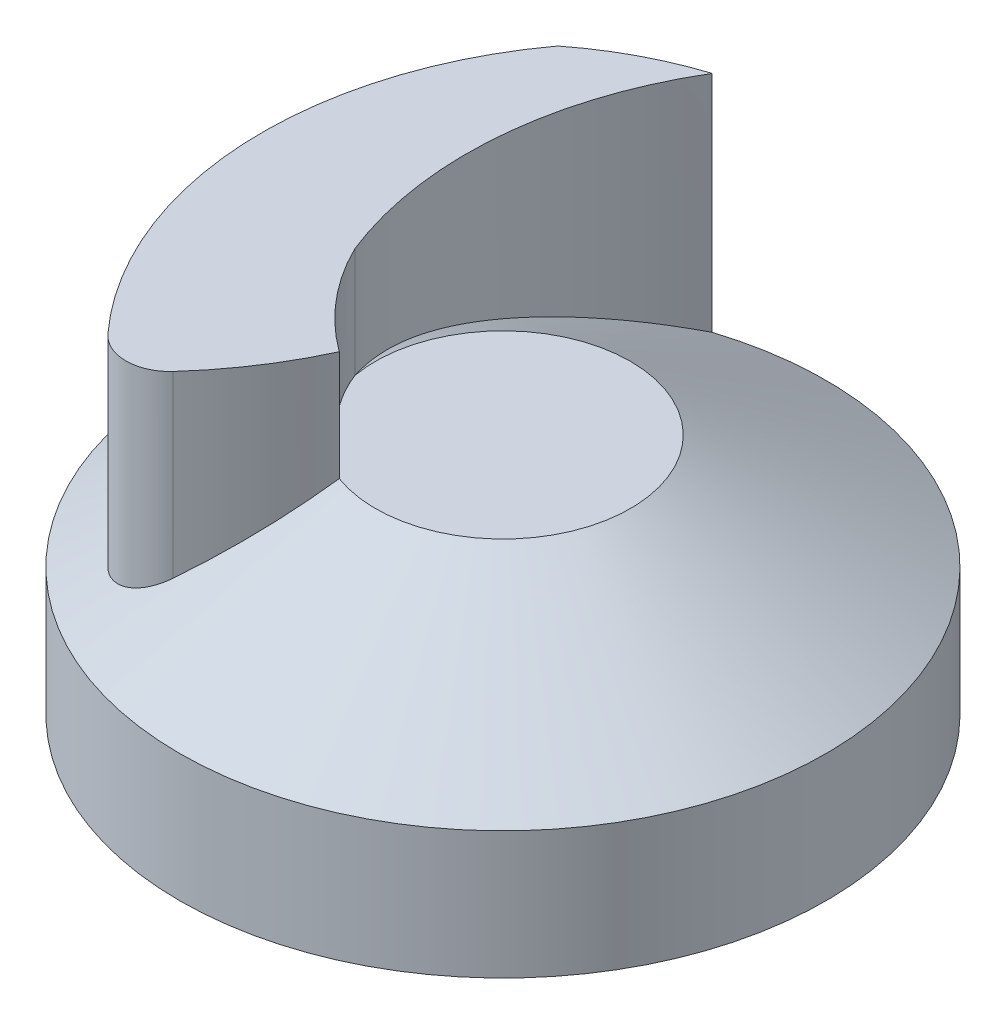
ISO-10303-21;
HEADER;
FILE_DESCRIPTION(('STEP AP214'),'2;1');
FILE_NAME('part.step','',(''),(''),'','','');
FILE_SCHEMA(('AUTOMOTIVE_DESIGN { 1 0 10303 214 1 1 1 1 }'));
ENDSEC;
DATA;
#1=APPLICATION_CONTEXT('core data for automotive mechanical design processes');
#2=APPLICATION_PROTOCOL_DEFINITION('international standard','automotive_design',2000,#1);
#3=PRODUCT_CONTEXT('',#1,'mechanical');
#4=PRODUCT('Part','Part','',(#3));
#5=PRODUCT_RELATED_PRODUCT_CATEGORY('part','',(#4));
#6=PRODUCT_DEFINITION_FORMATION('','',#4);
#7=PRODUCT_DEFINITION_CONTEXT('part definition',#1,'design');
#8=PRODUCT_DEFINITION('design','',#6,#7);
#9=PRODUCT_DEFINITION_SHAPE('','',#8);
#10=(LENGTH_UNIT() NAMED_UNIT(*) SI_UNIT(.MILLI.,.METRE.));
#11=(NAMED_UNIT(*) PLANE_ANGLE_UNIT() SI_UNIT($,.RADIAN.));
#12=(NAMED_UNIT(*) SI_UNIT($,.STERADIAN.) SOLID_ANGLE_UNIT());
#13=UNCERTAINTY_MEASURE_WITH_UNIT(LENGTH_MEASURE(1.E-05),#10,'distance_accuracy_value','');
#14=(GEOMETRIC_REPRESENTATION_CONTEXT(3) GLOBAL_UNCERTAINTY_ASSIGNED_CONTEXT((#13)) GLOBAL_UNIT_ASSIGNED_CONTEXT((#10,
#11,#12)) REPRESENTATION_CONTEXT('',''));
#15=CARTESIAN_POINT('',(0.,0.,0.));
#16=DIRECTION('',(0.,0.,1.));
#17=DIRECTION('',(1.,0.,0.));
#18=AXIS2_PLACEMENT_3D('',#15,#16,#17);
#19=CARTESIAN_POINT('',(0.,55.,0.));
#20=DIRECTION('',(0.,-1.,0.));
#21=DIRECTION('',(0.,0.,-1.));
#22=AXIS2_PLACEMENT_3D('',#19,#20,#21);
#23=CONICAL_SURFACE('',#22,29.,1.0420235544597);
#24=CARTESIAN_POINT('',(0.,29.,0.));
#25=DIRECTION('',(0.,1.,0.));
#26=DIRECTION('',(0.,0.,1.));
#27=AXIS2_PLACEMENT_3D('',#24,#25,#26);
#28=CIRCLE('',#27,73.5);
#29=CARTESIAN_POINT('',(-45.3802712873351,29.,-57.8176528223679));
#30=VERTEX_POINT('',#29);
#31=CARTESIAN_POINT('',(-22.4109348310149,29.,-70.));
#32=VERTEX_POINT('',#31);
#33=EDGE_CURVE('E42',#30,#32,#28,.T.);
#34=ORIENTED_EDGE('',*,*,#33,.T.);
#35=CARTESIAN_POINT('',(-28.5496093591363,55.0000251123417,5.09090488613945));
#36=CARTESIAN_POINT('',(-28.7247293869199,54.9445886567146,4.64936329136834));
#37=CARTESIAN_POINT('',(-28.8959571431098,54.8849374572389,4.20683193821065));
#38=CARTESIAN_POINT('',(-29.2306068688858,54.7575686923744,3.32000095261469));
#39=CARTESIAN_POINT('',(-29.3940291400212,54.6898514389553,2.87570138920728));
#40=CARTESIAN_POINT('',(-29.8724651668681,54.4751879033156,1.54072436381063));
#41=CARTESIAN_POINT('',(-30.1757695225688,54.3166909231365,0.647662283714218));
#42=CARTESIAN_POINT('',(-30.7505635430646,53.9723720468749,-1.14151408025421));
#43=CARTESIAN_POINT('',(-31.022109283024,53.7865996598121,-2.03762001914171));
#44=CARTESIAN_POINT('',(-31.5342123318471,53.3906673983505,-3.8333534641001));
#45=CARTESIAN_POINT('',(-31.7747671321185,53.1805055523369,-4.73298124918472));
#46=CARTESIAN_POINT('',(-32.2241151556233,52.739825623971,-6.5306637466509));
#47=CARTESIAN_POINT('',(-32.4330446938781,52.5094020932246,-7.42870770081441));
#48=CARTESIAN_POINT('',(-32.820714659758,52.030184860642,-9.22635561490741));
#49=CARTESIAN_POINT('',(-32.9994560289516,51.7813917321012,-10.1259595252974));
#50=CARTESIAN_POINT('',(-33.3271810464768,51.2677673164424,-11.926621456102));
#51=CARTESIAN_POINT('',(-33.4761460304203,51.0029261047628,-12.8276800338834));
#52=CARTESIAN_POINT('',(-33.7444993726721,50.4595583373506,-14.6300865371042));
#53=CARTESIAN_POINT('',(-33.8638865543755,50.1810312377214,-15.5314344726265));
#54=CARTESIAN_POINT('',(-34.112134747156,49.5070347498777,-17.6672597962915));
#55=CARTESIAN_POINT('',(-34.2281625516512,49.1064207652498,-18.9016241749851));
#56=CARTESIAN_POINT('',(-34.4059766386284,48.2874492487803,-21.3684022718282));
#57=CARTESIAN_POINT('',(-34.4677593796237,47.8690905603128,-22.6008158573742));
#58=CARTESIAN_POINT('',(-34.5377134517432,47.0181034304952,-25.0623315930712));
#59=CARTESIAN_POINT('',(-34.5458805413163,46.5854738628924,-26.2914334735437));
#60=CARTESIAN_POINT('',(-34.5091660389487,45.7088709823813,-28.7447457629525));
#61=CARTESIAN_POINT('',(-34.4642854938114,45.2648978934871,-29.9689562679332));
#62=CARTESIAN_POINT('',(-34.321750676871,44.3663533566904,-32.4154419007068));
#63=CARTESIAN_POINT('',(-34.2239056756637,43.911749321794,-33.6376939228971));
#64=CARTESIAN_POINT('',(-33.9758315836886,42.9955038144428,-36.0742181547678));
#65=CARTESIAN_POINT('',(-33.8256020109763,42.5338622772796,-37.2884902909275));
#66=CARTESIAN_POINT('',(-33.4732784284575,41.6052689926367,-39.7072956347435));
#67=CARTESIAN_POINT('',(-33.271190289594,41.1383178519759,-40.9118299289154));
#68=CARTESIAN_POINT('',(-32.8156834848174,40.2005059983908,-43.3095156354489));
#69=CARTESIAN_POINT('',(-32.5622657469904,39.7296453563016,-44.5026672532113));
#70=CARTESIAN_POINT('',(-31.7795579163247,38.4041001980136,-47.8336555198943));
#71=CARTESIAN_POINT('',(-31.1926515501607,37.5462457656495,-49.9570008665083));
#72=CARTESIAN_POINT('',(-29.8564335804122,35.8277238163859,-54.1502866897657));
#73=CARTESIAN_POINT('',(-29.1071331114241,34.9670564963358,-56.2202308169949));
#74=CARTESIAN_POINT('',(-27.4543596719912,33.2519088563651,-60.2855556958705));
#75=CARTESIAN_POINT('',(-26.551743048287,32.397420261479,-62.2812793622678));
#76=CARTESIAN_POINT('',(-25.0837272321493,31.1198226341435,-65.2192330188066));
#77=CARTESIAN_POINT('',(-24.5753056186949,30.6945951886593,-66.1893920133372));
#78=CARTESIAN_POINT('',(-23.5210092894647,29.8458722644486,-68.1099261270441));
#79=CARTESIAN_POINT('',(-22.9751342759545,29.4223767995188,-69.0603010888697));
#80=CARTESIAN_POINT('',(-22.4108147497686,28.9999101028993,-70.0002));
#81=B_SPLINE_CURVE_WITH_KNOTS('',3,(#35,#36,#37,#38,#39,#40,#41,#42,#43,#44,#45,#46,#47,#48,#49,
#50,#51,#52,#53,#54,#55,#56,#57,#58,#59,#60,#61,#62,#63,#64,#65,#66,#67,#68,#69,#70,#71,#72,#73,
#74,#75,#76,#77,#78,#79,#80),.UNSPECIFIED.,.F.,.F.,(4,2,2,2,2,2,2,2,2,2,2,2,2,2,2,2,2,2,2,2,2,2,
4),(0.,1.43459789234834,2.86914031695721,5.7372309080942,8.60017840597506,11.4633575025661,
14.3138206220499,17.1641948192244,20.0163501192061,22.8686188597161,26.776025160962,
30.6836865452975,34.591657062229,38.4995504633927,42.4216110513209,46.3437077236409,
50.2653605685007,54.186942512629,61.2724947180983,68.3575612543428,75.4042826096296,
78.9284892230699,82.4527238553029),.UNSPECIFIED.);
#82=CARTESIAN_POINT('',(-28.5496886806535,55.,5.09070488613945));
#83=VERTEX_POINT('',#82);
#84=EDGE_CURVE('E92',#83,#32,#81,.T.);
#85=ORIENTED_EDGE('',*,*,#84,.F.);
#86=CARTESIAN_POINT('',(0.,55.,0.));
#87=DIRECTION('',(0.,1.,0.));
#88=DIRECTION('',(0.,0.,1.));
#89=AXIS2_PLACEMENT_3D('',#86,#87,#88);
#90=CIRCLE('',#89,29.);
#91=CARTESIAN_POINT('',(-10.,55.,27.2213151776324));
#92=VERTEX_POINT('',#91);
#93=EDGE_CURVE('E200',#92,#83,#90,.T.);
#94=ORIENTED_EDGE('',*,*,#93,.F.);
#95=CARTESIAN_POINT('',(-25.0001805905201,39.2820014331821,50.0002));
#96=CARTESIAN_POINT('',(-24.2302435684098,39.9287819968627,49.1475154465924));
#97=CARTESIAN_POINT('',(-23.4772520738642,40.5770039817991,48.2807691942579));
#98=CARTESIAN_POINT('',(-22.0059363113249,41.8762056707809,46.5203565612396));
#99=CARTESIAN_POINT('',(-21.2876116941636,42.5271853469787,45.6266904518421));
#100=CARTESIAN_POINT('',(-19.1920482387325,44.4782564394082,42.9152020699937));
#101=CARTESIAN_POINT('',(-17.8673186281698,45.7822690667879,41.0592381409055));
#102=CARTESIAN_POINT('',(-15.3648999147257,48.3987321464562,37.2564401960887));
#103=CARTESIAN_POINT('',(-14.1872088014585,49.7111824831222,35.3096074232658));
#104=CARTESIAN_POINT('',(-12.5326639744902,51.6875370241471,32.3252642255017));
#105=CARTESIAN_POINT('',(-11.9987482249833,52.3490876723367,31.3174781194841));
#106=CARTESIAN_POINT('',(-10.9699355013665,53.6735963781706,29.2830952167538));
#107=CARTESIAN_POINT('',(-10.4750383939112,54.3365544309971,28.2564984843408));
#108=CARTESIAN_POINT('',(-9.99990822117822,55.0001281777053,27.2211151776324));
#109=B_SPLINE_CURVE_WITH_KNOTS('',3,(#95,#96,#97,#98,#99,#100,#101,#102,#103,#104,#105,#106,
#107,#108),.UNSPECIFIED.,.F.,.F.,(4,2,2,2,2,2,4),(0.,3.9548527858312,7.90966572974658,
15.7839064883536,23.6580395745044,27.6128088161583,31.5675645418742),.UNSPECIFIED.);
#110=CARTESIAN_POINT('',(-25.,39.2821531376435,50.));
#111=VERTEX_POINT('',#110);
#112=EDGE_CURVE('E49',#111,#92,#109,.T.);
#113=ORIENTED_EDGE('',*,*,#112,.F.);
#114=CARTESIAN_POINT('',(-39.8270914709987,34.5867522655805,50.018777727555));
#115=CARTESIAN_POINT('',(-39.6567234212681,34.5629342375431,50.2065580385633));
#116=CARTESIAN_POINT('',(-39.4788566286282,34.5438071174008,50.3881363762668));
#117=CARTESIAN_POINT('',(-39.1094261465787,34.5150414548326,50.737577514022));
#118=CARTESIAN_POINT('',(-38.9178630144057,34.5054025266144,50.9054408714739));
#119=CARTESIAN_POINT('',(-38.522725270415,34.4957278222526,51.2258325040002));
#120=CARTESIAN_POINT('',(-38.3191756647436,34.4956727160212,51.3783910266266));
#121=CARTESIAN_POINT('',(-37.9012028926494,34.50511279651,51.6674575146318));
#122=CARTESIAN_POINT('',(-37.6867800408312,34.5146077070612,51.8039659440223));
#123=CARTESIAN_POINT('',(-37.2485363074208,34.5430687118088,52.0600819310439));
#124=CARTESIAN_POINT('',(-37.0247110254465,34.562039286927,52.1796814583053));
#125=CARTESIAN_POINT('',(-36.5694205209893,34.6092835271021,52.4011971956577));
#126=CARTESIAN_POINT('',(-36.3379550814803,34.6375574566349,52.5031129029071));
#127=CARTESIAN_POINT('',(-35.8691044700781,34.7031600794735,52.6887580097667));
#128=CARTESIAN_POINT('',(-35.6317194394586,34.7404885568737,52.7724878429289));
#129=CARTESIAN_POINT('',(-35.1527352151216,34.8238855760797,52.9214789628403));
#130=CARTESIAN_POINT('',(-34.911135997719,34.8699541670223,52.9867401457539));
#131=CARTESIAN_POINT('',(-34.4220667123093,34.9711505806392,53.0994769725287));
#132=CARTESIAN_POINT('',(-34.1745615769713,35.0263940496457,53.1466962499646));
#133=CARTESIAN_POINT('',(-33.6786308436411,35.1450479880956,53.2221711951305));
#134=CARTESIAN_POINT('',(-33.4302052402213,35.2084585057709,53.2504267508607));
#135=CARTESIAN_POINT('',(-32.9340042179046,35.3429856418787,53.2882511364478));
#136=CARTESIAN_POINT('',(-32.686228863784,35.4141030002754,53.2978181702652));
#137=CARTESIAN_POINT('',(-32.1927537084432,35.5635746789883,53.2986820299571));
#138=CARTESIAN_POINT('',(-31.9470547207979,35.6419317044328,53.289971999931));
#139=CARTESIAN_POINT('',(-31.4417082175656,35.8112170928674,53.253546614573));
#140=CARTESIAN_POINT('',(-31.182322431993,35.9026439157979,53.2245144166262));
#141=CARTESIAN_POINT('',(-30.669063753363,36.0926162025022,53.1468417233973));
#142=CARTESIAN_POINT('',(-30.4151929566308,36.1911643136624,53.098193904776));
#143=CARTESIAN_POINT('',(-29.9144221479294,36.3947363822203,52.9821637712528));
#144=CARTESIAN_POINT('',(-29.6675224934616,36.49976067086,52.9147804974544));
#145=CARTESIAN_POINT('',(-29.1818531974549,36.7157064766536,52.762195624983));
#146=CARTESIAN_POINT('',(-28.9430864779007,36.8266300773931,52.6769876992093));
#147=CARTESIAN_POINT('',(-28.4502668148856,37.0656758787659,52.4799098789511));
#148=CARTESIAN_POINT('',(-28.1972394123735,37.1943813157933,52.3661803505147));
#149=CARTESIAN_POINT('',(-27.7038049857039,37.4574626797582,52.1195071894869));
#150=CARTESIAN_POINT('',(-27.4633991975926,37.5918391597505,51.9865616798239));
#151=CARTESIAN_POINT('',(-26.9964227799646,37.8654541863057,51.7028615418061));
#152=CARTESIAN_POINT('',(-26.769847121483,38.0046909362596,51.552113446121));
#153=CARTESIAN_POINT('',(-26.3314561951344,38.2873145917907,51.2341349167459));
#154=CARTESIAN_POINT('',(-26.1196365197343,38.4307002398457,51.0669094411067));
#155=CARTESIAN_POINT('',(-25.7526514102356,38.6917096464332,50.7524748800498));
#156=CARTESIAN_POINT('',(-25.5946675550872,38.8087059337068,50.6080173577931));
#157=CARTESIAN_POINT('',(-25.2893122947923,39.0443168429925,50.310361057051));
#158=CARTESIAN_POINT('',(-25.1419185726763,39.1629273954642,50.1571819574197));
#159=CARTESIAN_POINT('',(-24.999819414915,39.2823048406305,49.9998));
#160=B_SPLINE_CURVE_WITH_KNOTS('',3,(#114,#115,#116,#117,#118,#119,#120,#121,#122,#123,#124,
#125,#126,#127,#128,#129,#130,#131,#132,#133,#134,#135,#136,#137,#138,#139,#140,#141,#142,#143,
#144,#145,#146,#147,#148,#149,#150,#151,#152,#153,#154,#155,#156,#157,#158,#159),.UNSPECIFIED.,
.F.,.F.,(4,2,2,2,2,2,2,2,2,2,2,2,2,2,2,2,2,2,2,2,2,2,4),(0.,0.763775088407774,1.52751912023176,
2.28972270079676,3.0519042404749,3.81444654786146,4.57701053467608,5.33955633993642,
6.10210643234286,6.8751212115434,7.64814055613259,8.42123418722674,9.19461786493888,
10.0234069020394,10.8525056479899,11.6816468357316,12.5110828392578,13.4275665681897,
14.3441398824258,15.260377898552,16.1763410553222,16.9078317263136,17.6377327130041),.UNSPECIFIED.);
#161=CARTESIAN_POINT('',(-39.8268914709987,34.5867243304696,50.0189980924498));
#162=VERTEX_POINT('',#161);
#163=EDGE_CURVE('E162',#162,#111,#160,.T.);
#164=ORIENTED_EDGE('',*,*,#163,.F.);
#165=CARTESIAN_POINT('',(-45.3801242042821,28.9999611370027,-57.8178528223679));
#166=CARTESIAN_POINT('',(-46.0936625235382,29.1884900463303,-56.8476282385105));
#167=CARTESIAN_POINT('',(-46.786778690679,29.3753720268394,-55.862061308107));
#168=CARTESIAN_POINT('',(-48.1309548762064,29.7453591388384,-53.8619558729894));
#169=CARTESIAN_POINT('',(-48.7820146257098,29.9284642461761,-52.8474171831072));
#170=CARTESIAN_POINT('',(-50.0408893452799,30.2904215041911,-50.7910409235312));
#171=CARTESIAN_POINT('',(-50.6487020897682,30.4692734356765,-49.7492019526793));
#172=CARTESIAN_POINT('',(-51.8199090963239,30.8222136861132,-47.6400639854042));
#173=CARTESIAN_POINT('',(-52.3833034903914,30.9963020192196,-46.5727650646538));
#174=CARTESIAN_POINT('',(-53.4649656848338,31.3393201139603,-44.413812375013));
#175=CARTESIAN_POINT('',(-53.983202952125,31.508246335873,-43.3221427448229));
#176=CARTESIAN_POINT('',(-54.9731684852204,31.8403122651744,-41.1169247708001));
#177=CARTESIAN_POINT('',(-55.4448923840807,32.0034514283219,-40.0033743844235));
#178=CARTESIAN_POINT('',(-56.3407837836841,32.3233769574339,-37.7565769093136));
#179=CARTESIAN_POINT('',(-56.7649574717557,32.4801641482302,-36.6233324054351));
#180=CARTESIAN_POINT('',(-57.5649978660795,32.7868894282336,-34.3388811966237));
#181=CARTESIAN_POINT('',(-57.9408600261195,32.9368268720112,-33.1876728126673));
#182=CARTESIAN_POINT('',(-58.6426823833452,33.2289829753578,-30.8719576067118));
#183=CARTESIAN_POINT('',(-58.9687496348095,33.3712177572546,-29.7074852669008));
#184=CARTESIAN_POINT('',(-59.5712948996856,33.6478037915859,-27.3647329343391));
#185=CARTESIAN_POINT('',(-59.8477681972535,33.782154293495,-26.1864516398443));
#186=CARTESIAN_POINT('',(-60.3504548929229,34.042424079709,-23.8183877432582));
#187=CARTESIAN_POINT('',(-60.5766721691074,34.1683440140473,-22.6286060360127));
#188=CARTESIAN_POINT('',(-60.978367977323,34.4112641411617,-20.2394815651454));
#189=CARTESIAN_POINT('',(-61.1538415733377,34.528263465384,-19.040137883049));
#190=CARTESIAN_POINT('',(-61.4534345896769,34.7527197010849,-16.6354060362491));
#191=CARTESIAN_POINT('',(-61.5776057663522,34.8601861433906,-15.4300252111546));
#192=CARTESIAN_POINT('',(-61.7745228934633,35.0652495449596,-13.0140834218991));
#193=CARTESIAN_POINT('',(-61.847262612167,35.1628453070071,-11.8035218478804));
#194=CARTESIAN_POINT('',(-61.9410521912171,35.3477059807402,-9.37963409089838));
#195=CARTESIAN_POINT('',(-61.9621031094224,35.4349711038171,-8.16630796502278));
#196=CARTESIAN_POINT('',(-61.9523819776495,35.5987517912751,-5.73928688109257));
#197=CARTESIAN_POINT('',(-61.9216164278098,35.6752687026656,-4.52559198839356));
#198=CARTESIAN_POINT('',(-61.8094624057383,35.8156709561863,-2.12602039361718));
#199=CARTESIAN_POINT('',(-61.7291750267377,35.8797922335283,-0.940105918359291));
#200=CARTESIAN_POINT('',(-61.5190461527697,35.9970879287059,1.42774845684583));
#201=CARTESIAN_POINT('',(-61.3892097363963,36.0502634675799,2.60968875161112));
#202=CARTESIAN_POINT('',(-61.0801444867468,36.1454209577458,4.96764809671918));
#203=CARTESIAN_POINT('',(-60.9009115332884,36.1874019747239,6.14366664479129));
#204=CARTESIAN_POINT('',(-60.493356767924,36.2599531474101,8.48740560922283));
#205=CARTESIAN_POINT('',(-60.2650396795367,36.2905244003413,9.65512681289895));
#206=CARTESIAN_POINT('',(-59.7595037432887,36.3401265070974,11.9810869469922));
#207=CARTESIAN_POINT('',(-59.4822489194629,36.3591488248765,13.1393182410032));
#208=CARTESIAN_POINT('',(-58.8794713955479,36.3855198611614,15.4431660392387));
#209=CARTESIAN_POINT('',(-58.553953384612,36.3928697129289,16.5887837573695));
#210=CARTESIAN_POINT('',(-57.8551823577046,36.3958619793498,18.8655285870122));
#211=CARTESIAN_POINT('',(-57.4819238618153,36.3915030488536,19.996654018595));
#212=CARTESIAN_POINT('',(-56.6884333310339,36.371098261799,22.2420873813765));
#213=CARTESIAN_POINT('',(-56.2682052366001,36.355053384997,23.3563967144524));
#214=CARTESIAN_POINT('',(-55.3540391795771,36.3100033810273,25.6347926027769));
#215=CARTESIAN_POINT('',(-54.8571461167426,36.2802561686505,26.7976801176292));
#216=CARTESIAN_POINT('',(-53.8123094609867,36.207840881177,29.0998908304051));
#217=CARTESIAN_POINT('',(-53.2643651793051,36.1651726317381,30.2392137101518));
#218=CARTESIAN_POINT('',(-52.1185568390684,36.0671495603475,32.4920680225858));
#219=CARTESIAN_POINT('',(-51.5206875201865,36.0117934004656,33.6055967216524));
#220=CARTESIAN_POINT('',(-50.2763797563469,35.8887021033549,35.8044705318522));
#221=CARTESIAN_POINT('',(-49.6299414246243,35.8209669949861,36.8898157086854));
#222=CARTESIAN_POINT('',(-48.289183388917,35.673403928043,39.0312801531028));
#223=CARTESIAN_POINT('',(-47.5948135550027,35.5935632009458,40.087367152574));
#224=CARTESIAN_POINT('',(-46.1603022628458,35.4222609180918,42.1670195767059));
#225=CARTESIAN_POINT('',(-45.420160485475,35.3307992813078,43.1905847745451));
#226=CARTESIAN_POINT('',(-43.8957675238269,35.1367286661861,45.2030744020717));
#227=CARTESIAN_POINT('',(-43.1115204899161,35.0341207358867,46.1920020770337));
#228=CARTESIAN_POINT('',(-41.5005515581568,34.8182633334745,48.1334075857472));
#229=CARTESIAN_POINT('',(-40.673830241347,34.7050140069161,49.0858859178066));
#230=CARTESIAN_POINT('',(-39.8267099478786,34.5866989784687,50.0191980924498));
#231=B_SPLINE_CURVE_WITH_KNOTS('',3,(#165,#166,#167,#168,#169,#170,#171,#172,#173,#174,#175,
#176,#177,#178,#179,#180,#181,#182,#183,#184,#185,#186,#187,#188,#189,#190,#191,#192,#193,#194,
#195,#196,#197,#198,#199,#200,#201,#202,#203,#204,#205,#206,#207,#208,#209,#210,#211,#212,#213,
#214,#215,#216,#217,#218,#219,#220,#221,#222,#223,#224,#225,#226,#227,#228,#229,#230),
.UNSPECIFIED.,.F.,.F.,(4,2,2,2,2,2,2,2,2,2,2,2,2,2,2,2,2,2,2,2,2,2,2,2,2,2,2,2,2,2,2,2,4),(0.,
3.6568033150793,7.31363000721162,10.9706447511397,14.6276486269306,18.2871063105614,
21.9469072387392,25.6062313921624,29.2658996436509,32.9175857049196,36.5696188178314,
40.2213700180302,43.8734763175228,47.5218891463462,51.1707439621962,54.8195241002491,
58.4678465496522,62.0378368912308,65.6074614201625,69.1773837828694,72.7469627545154,
76.3191768705778,79.8910441447083,83.4633217861573,87.0352999602749,90.8288144302022,
94.622380087937,98.4163459584042,102.210302983791,106.008289925211,109.806303349692,
113.60395997187,117.401564656774),.UNSPECIFIED.);
#232=EDGE_CURVE('E142',#30,#162,#231,.T.);
#233=ORIENTED_EDGE('',*,*,#232,.F.);
#234=EDGE_LOOP('',(#34,#85,#94,#113,#164,#233));
#235=FACE_BOUND('',#234,.T.);
#236=ADVANCED_FACE('F34',(#235),#23,.T.);
#237=CARTESIAN_POINT('',(0.,0.,0.));
#238=DIRECTION('',(0.,-1.,0.));
#239=DIRECTION('',(0.,0.,-1.));
#240=AXIS2_PLACEMENT_3D('',#237,#238,#239);
#241=PLANE('',#240);
#242=CARTESIAN_POINT('',(0.,0.,0.));
#243=DIRECTION('',(0.,1.,0.));
#244=DIRECTION('',(0.,0.,1.));
#245=AXIS2_PLACEMENT_3D('',#242,#243,#244);
#246=CIRCLE('',#245,73.5);
#247=CARTESIAN_POINT('',(0.,0.,73.5));
#248=VERTEX_POINT('',#247);
#249=EDGE_CURVE('E11',#248,#248,#246,.T.);
#250=ORIENTED_EDGE('',*,*,#249,.F.);
#251=EDGE_LOOP('',(#250));
#252=FACE_BOUND('',#251,.T.);
#253=ADVANCED_FACE('F36',(#252),#241,.T.);
#254=CARTESIAN_POINT('',(0.,0.,0.));
#255=DIRECTION('',(0.,1.,0.));
#256=DIRECTION('',(0.,0.,1.));
#257=AXIS2_PLACEMENT_3D('',#254,#255,#256);
#258=CYLINDRICAL_SURFACE('',#257,73.5);
#259=ORIENTED_EDGE('',*,*,#249,.T.);
#260=EDGE_LOOP('',(#259));
#261=FACE_BOUND('',#260,.T.);
#262=ORIENTED_EDGE('',*,*,#33,.F.);
#263=DIRECTION('',(0.,1.,0.));
#264=VECTOR('',#263,1.);
#265=CARTESIAN_POINT('',(-45.3802712873351,-0.001000000000001,-57.8176528223679));
#266=LINE('',#265,#264);
#267=CARTESIAN_POINT('',(-45.3802712873351,80.,-57.8176528223679));
#268=VERTEX_POINT('',#267);
#269=EDGE_CURVE('E130',#30,#268,#266,.T.);
#270=ORIENTED_EDGE('',*,*,#269,.T.);
#271=CARTESIAN_POINT('',(0.,80.,0.));
#272=DIRECTION('',(0.,-1.,0.));
#273=DIRECTION('',(0.,0.,-1.));
#274=AXIS2_PLACEMENT_3D('',#271,#272,#273);
#275=CIRCLE('',#274,73.5);
#276=CARTESIAN_POINT('',(-22.4109348310149,80.,-70.));
#277=VERTEX_POINT('',#276);
#278=EDGE_CURVE('E122',#268,#277,#275,.T.);
#279=ORIENTED_EDGE('',*,*,#278,.T.);
#280=DIRECTION('',(0.,1.,0.));
#281=VECTOR('',#280,1.);
#282=CARTESIAN_POINT('',(-22.4109348310149,-0.001000000000001,-70.));
#283=LINE('',#282,#281);
#284=EDGE_CURVE('E128',#32,#277,#283,.T.);
#285=ORIENTED_EDGE('',*,*,#284,.F.);
#286=EDGE_LOOP('',(#262,#270,#279,#285));
#287=FACE_BOUND('',#286,.T.);
#288=ADVANCED_FACE('F183',(#261,#287),#258,.T.);
#289=CARTESIAN_POINT('',(-29.,55.,0.));
#290=DIRECTION('',(0.,1.,0.));
#291=DIRECTION('',(0.,0.,1.));
#292=AXIS2_PLACEMENT_3D('',#289,#290,#291);
#293=PLANE('',#292);
#294=EDGE_CURVE('E143',#83,#92,#90,.T.);
#295=ORIENTED_EDGE('',*,*,#294,.T.);
#296=ORIENTED_EDGE('',*,*,#93,.T.);
#297=EDGE_LOOP('',(#295,#296));
#298=FACE_BOUND('',#297,.T.);
#299=ADVANCED_FACE('F180',(#298),#293,.T.);
#300=CARTESIAN_POINT('',(37.9100601593128,80.,-23.7501752730789));
#301=DIRECTION('',(0.,-1.,0.));
#302=DIRECTION('',(0.,0.,-1.));
#303=AXIS2_PLACEMENT_3D('',#300,#301,#302);
#304=PLANE('',#303);
#305=CARTESIAN_POINT('',(25.357160112374,80.,-21.2541552046955));
#306=DIRECTION('',(0.,1.,0.));
#307=DIRECTION('',(0.,0.,-1.));
#308=AXIS2_PLACEMENT_3D('',#305,#306,#307);
#309=CIRCLE('',#308,60.);
#310=CARTESIAN_POINT('',(-28.5496886806535,80.,5.09070488613944));
#311=VERTEX_POINT('',#310);
#312=CARTESIAN_POINT('',(-10.,80.,27.2213151776324));
#313=VERTEX_POINT('',#312);
#314=EDGE_CURVE('E98',#311,#313,#309,.T.);
#315=ORIENTED_EDGE('',*,*,#314,.F.);
#316=CARTESIAN_POINT('',(50.4629602062515,80.,-26.2461953414623));
#317=DIRECTION('',(0.,1.,0.));
#318=DIRECTION('',(0.,0.,-1.));
#319=AXIS2_PLACEMENT_3D('',#316,#317,#318);
#320=CIRCLE('',#319,85.);
#321=EDGE_CURVE('E125',#277,#311,#320,.T.);
#322=ORIENTED_EDGE('',*,*,#321,.F.);
#323=ORIENTED_EDGE('',*,*,#278,.F.);
#324=CARTESIAN_POINT('',(23.3203988612121,80.,-7.29428537018002));
#325=DIRECTION('',(0.,-1.,0.));
#326=DIRECTION('',(0.,0.,-1.));
#327=AXIS2_PLACEMENT_3D('',#324,#325,#326);
#328=CIRCLE('',#327,85.278325133461);
#329=CARTESIAN_POINT('',(-39.8268914709987,80.,50.0189980924498));
#330=VERTEX_POINT('',#329);
#331=EDGE_CURVE('E119',#330,#268,#328,.T.);
#332=ORIENTED_EDGE('',*,*,#331,.F.);
#333=CARTESIAN_POINT('',(-32.4220450187044,80.,43.2982653185668));
#334=DIRECTION('',(0.,-1.,0.));
#335=DIRECTION('',(0.,0.,1.));
#336=AXIS2_PLACEMENT_3D('',#333,#334,#335);
#337=CIRCLE('',#336,10.);
#338=CARTESIAN_POINT('',(-25.,80.,50.));
#339=VERTEX_POINT('',#338);
#340=EDGE_CURVE('E101',#339,#330,#337,.T.);
#341=ORIENTED_EDGE('',*,*,#340,.F.);
#342=CARTESIAN_POINT('',(-91.7984051683398,80.,-10.315612132899));
#343=DIRECTION('',(0.,-1.,0.));
#344=DIRECTION('',(0.,0.,-1.));
#345=AXIS2_PLACEMENT_3D('',#342,#343,#344);
#346=CIRCLE('',#345,90.);
#347=EDGE_CURVE('E86',#313,#339,#346,.T.);
#348=ORIENTED_EDGE('',*,*,#347,.F.);
#349=EDGE_LOOP('',(#315,#322,#323,#332,#341,#348));
#350=FACE_BOUND('',#349,.T.);
#351=ADVANCED_FACE('F96',(#350),#304,.F.);
#352=CARTESIAN_POINT('',(50.4629602062515,-0.001000000000001,-26.2461953414623));
#353=DIRECTION('',(0.,1.,0.));
#354=DIRECTION('',(0.,0.,1.));
#355=AXIS2_PLACEMENT_3D('',#352,#353,#354);
#356=CYLINDRICAL_SURFACE('',#355,85.);
#357=DIRECTION('',(0.,1.,0.));
#358=VECTOR('',#357,1.);
#359=CARTESIAN_POINT('',(-28.5496886806535,-0.001000000000001,5.09070488613944));
#360=LINE('',#359,#358);
#361=EDGE_CURVE('E105',#83,#311,#360,.T.);
#362=ORIENTED_EDGE('',*,*,#361,.F.);
#363=ORIENTED_EDGE('',*,*,#84,.T.);
#364=ORIENTED_EDGE('',*,*,#284,.T.);
#365=ORIENTED_EDGE('',*,*,#321,.T.);
#366=EDGE_LOOP('',(#362,#363,#364,#365));
#367=FACE_BOUND('',#366,.T.);
#368=ADVANCED_FACE('F144',(#367),#356,.F.);
#369=CARTESIAN_POINT('',(23.3203988612121,-0.001000000000001,-7.29428537018002));
#370=DIRECTION('',(0.,1.,0.));
#371=DIRECTION('',(0.,0.,1.));
#372=AXIS2_PLACEMENT_3D('',#369,#370,#371);
#373=CYLINDRICAL_SURFACE('',#372,85.278325133461);
#374=ORIENTED_EDGE('',*,*,#269,.F.);
#375=ORIENTED_EDGE('',*,*,#232,.T.);
#376=DIRECTION('',(0.,1.,0.));
#377=VECTOR('',#376,1.);
#378=CARTESIAN_POINT('',(-39.8268914709987,-0.001000000000001,50.0189980924498));
#379=LINE('',#378,#377);
#380=EDGE_CURVE('E132',#162,#330,#379,.T.);
#381=ORIENTED_EDGE('',*,*,#380,.T.);
#382=ORIENTED_EDGE('',*,*,#331,.T.);
#383=EDGE_LOOP('',(#374,#375,#381,#382));
#384=FACE_BOUND('',#383,.T.);
#385=ADVANCED_FACE('F208',(#384),#373,.T.);
#386=CARTESIAN_POINT('',(-32.4220450187044,-0.001000000000001,43.2982653185668));
#387=DIRECTION('',(0.,1.,0.));
#388=DIRECTION('',(0.,0.,1.));
#389=AXIS2_PLACEMENT_3D('',#386,#387,#388);
#390=CYLINDRICAL_SURFACE('',#389,10.);
#391=ORIENTED_EDGE('',*,*,#380,.F.);
#392=ORIENTED_EDGE('',*,*,#163,.T.);
#393=DIRECTION('',(0.,1.,0.));
#394=VECTOR('',#393,1.);
#395=CARTESIAN_POINT('',(-25.,-0.001000000000001,50.));
#396=LINE('',#395,#394);
#397=EDGE_CURVE('E54',#111,#339,#396,.T.);
#398=ORIENTED_EDGE('',*,*,#397,.T.);
#399=ORIENTED_EDGE('',*,*,#340,.T.);
#400=EDGE_LOOP('',(#391,#392,#398,#399));
#401=FACE_BOUND('',#400,.T.);
#402=ADVANCED_FACE('F175',(#401),#390,.T.);
#403=CARTESIAN_POINT('',(-91.7984051683398,-0.001000000000001,-10.315612132899));
#404=DIRECTION('',(0.,1.,0.));
#405=DIRECTION('',(0.,0.,1.));
#406=AXIS2_PLACEMENT_3D('',#403,#404,#405);
#407=CYLINDRICAL_SURFACE('',#406,90.);
#408=ORIENTED_EDGE('',*,*,#397,.F.);
#409=ORIENTED_EDGE('',*,*,#112,.T.);
#410=DIRECTION('',(0.,1.,0.));
#411=VECTOR('',#410,1.);
#412=CARTESIAN_POINT('',(-10.,-0.001000000000001,27.2213151776324));
#413=LINE('',#412,#411);
#414=EDGE_CURVE('E83',#92,#313,#413,.T.);
#415=ORIENTED_EDGE('',*,*,#414,.T.);
#416=ORIENTED_EDGE('',*,*,#347,.T.);
#417=EDGE_LOOP('',(#408,#409,#415,#416));
#418=FACE_BOUND('',#417,.T.);
#419=ADVANCED_FACE('F85',(#418),#407,.T.);
#420=CARTESIAN_POINT('',(25.357160112374,-0.001000000000001,-21.2541552046955));
#421=DIRECTION('',(0.,1.,0.));
#422=DIRECTION('',(0.,0.,1.));
#423=AXIS2_PLACEMENT_3D('',#420,#421,#422);
#424=CYLINDRICAL_SURFACE('',#423,60.);
#425=ORIENTED_EDGE('',*,*,#414,.F.);
#426=CARTESIAN_POINT('',(-9.99980000000001,54.9999602905889,27.2214610535017));
#427=CARTESIAN_POINT('',(-10.5313441782652,55.1055062012434,26.8337745771015));
#428=CARTESIAN_POINT('',(-11.0572825015047,55.2051732685194,26.4367651859424));
#429=CARTESIAN_POINT('',(-12.0972112193286,55.3918992658956,25.6244666803812));
#430=CARTESIAN_POINT('',(-12.6112006198684,55.4789571501521,25.2091760533989));
#431=CARTESIAN_POINT('',(-13.6266444722844,55.6396341412691,24.3605470369769));
#432=CARTESIAN_POINT('',(-14.1280929446092,55.7132469390705,23.9272002913023));
#433=CARTESIAN_POINT('',(-15.1173805243386,55.8462093584333,23.043153753262));
#434=CARTESIAN_POINT('',(-15.6052200489014,55.9055594176192,22.5924544938168));
#435=CARTESIAN_POINT('',(-16.5554938718436,56.0081467906728,21.6847692963252));
#436=CARTESIAN_POINT('',(-17.0182540091749,56.0517214720072,21.2281626887925));
#437=CARTESIAN_POINT('',(-17.9292442929167,56.1241298687265,20.2995480277288));
#438=CARTESIAN_POINT('',(-18.3774745332149,56.1529636793803,19.8275400737564));
#439=CARTESIAN_POINT('',(-19.2585265364431,56.1955457504843,18.8689568083335));
#440=CARTESIAN_POINT('',(-19.6913530723985,56.2092987239953,18.3823860968967));
#441=CARTESIAN_POINT('',(-20.5410014535145,56.2215782966039,17.3953325908141));
#442=CARTESIAN_POINT('',(-20.9578237031788,56.2201052807885,16.8948501483354));
#443=CARTESIAN_POINT('',(-22.0640852277872,56.1954905840509,15.5216780092279));
#444=CARTESIAN_POINT('',(-22.7376179299426,56.1577470025937,14.6363197434814));
#445=CARTESIAN_POINT('',(-24.0332220063045,56.03905842147,12.8313910859704));
#446=CARTESIAN_POINT('',(-24.6552880028693,55.9581089138802,11.9118171336014));
#447=CARTESIAN_POINT('',(-25.5539162532614,55.8052910277299,10.5008729415085));
#448=CARTESIAN_POINT('',(-25.8504366689529,55.7484037193562,10.0204378937484));
#449=CARTESIAN_POINT('',(-26.429274806792,55.6245445368181,9.05233186013473));
#450=CARTESIAN_POINT('',(-26.7115923063004,55.5575725046353,8.56466076100675));
#451=CARTESIAN_POINT('',(-27.2617330021704,55.414057346004,7.58277767661401));
#452=CARTESIAN_POINT('',(-27.5295599118696,55.3375166884015,7.08856740785598));
#453=CARTESIAN_POINT('',(-28.0506376873699,55.1753905273809,6.0940144413362));
#454=CARTESIAN_POINT('',(-28.3038892719382,55.0898054705693,5.59367204745233));
#455=CARTESIAN_POINT('',(-28.5497864223572,54.9999642915105,5.09050488613944));
#456=B_SPLINE_CURVE_WITH_KNOTS('',3,(#426,#427,#428,#429,#430,#431,#432,#433,#434,#435,#436,
#437,#438,#439,#440,#441,#442,#443,#444,#445,#446,#447,#448,#449,#450,#451,#452,#453,#454,#455),
.UNSPECIFIED.,.F.,.F.,(4,2,2,2,2,2,2,2,2,2,2,2,2,2,4),(0.,1.99887166191208,3.99790902144904,
5.9978820256198,7.99779365667141,9.95198055558778,11.9061548246146,13.8597182011975,
15.813232169486,19.149719850698,22.4865557149723,24.1885868103631,25.8906445778193,
27.5922640922365,29.2937996210219),.UNSPECIFIED.);
#457=EDGE_CURVE('E109',#92,#83,#456,.T.);
#458=ORIENTED_EDGE('',*,*,#457,.T.);
#459=ORIENTED_EDGE('',*,*,#361,.T.);
#460=ORIENTED_EDGE('',*,*,#314,.T.);
#461=EDGE_LOOP('',(#425,#458,#459,#460));
#462=FACE_BOUND('',#461,.T.);
#463=ADVANCED_FACE('F103',(#462),#424,.F.);
#464=CARTESIAN_POINT('',(0.,55.,0.));
#465=DIRECTION('',(0.,-1.,0.));
#466=DIRECTION('',(0.,0.,-1.));
#467=AXIS2_PLACEMENT_3D('',#464,#465,#466);
#468=CONICAL_SURFACE('',#467,29.,1.0420235544597);
#469=ORIENTED_EDGE('',*,*,#294,.F.);
#470=ORIENTED_EDGE('',*,*,#457,.F.);
#471=EDGE_LOOP('',(#469,#470));
#472=FACE_BOUND('',#471,.T.);
#473=ADVANCED_FACE('F148',(#472),#468,.F.);
#474=CLOSED_SHELL('',(#236,#253,#288,#299,#351,#368,#385,#402,#419,#463,#473));
#475=MANIFOLD_SOLID_BREP('B2',#474);
#476=ADVANCED_BREP_SHAPE_REPRESENTATION('',(#18,#475),#14);
#477=SHAPE_DEFINITION_REPRESENTATION(#9,#476);
ENDSEC;
END-ISO-10303-21;
